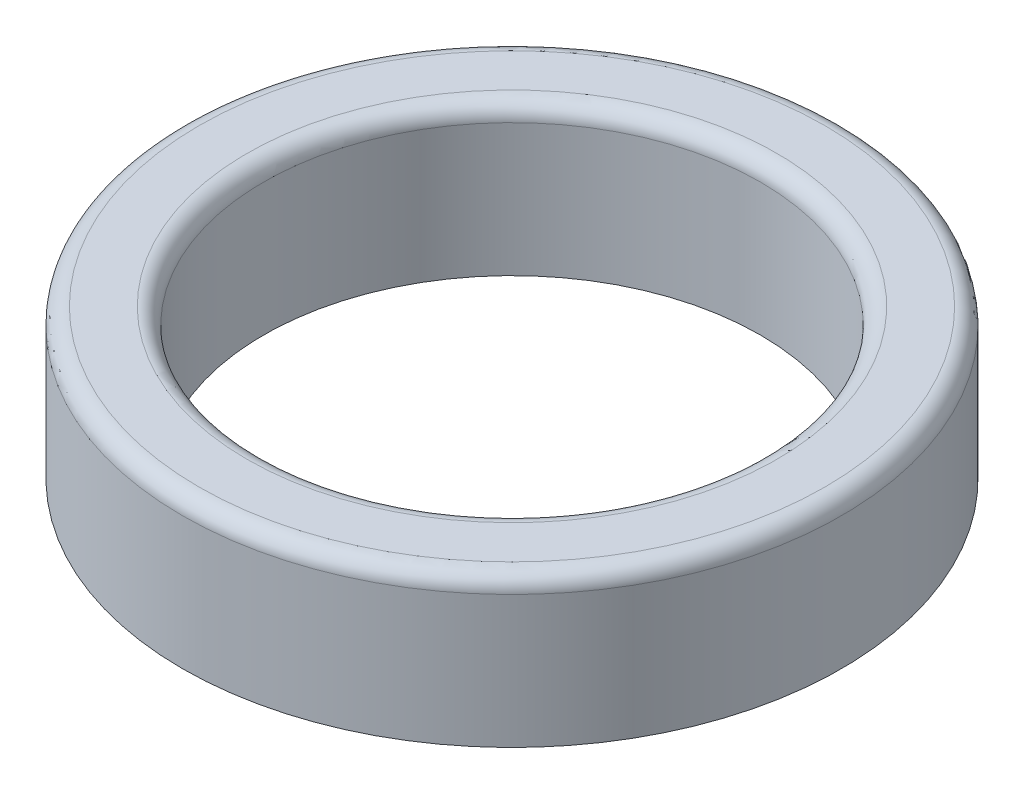
ISO-10303-21;
HEADER;
FILE_DESCRIPTION(('STEP AP214'),'2;1');
FILE_NAME('part.step','',(''),(''),'','','');
FILE_SCHEMA(('AUTOMOTIVE_DESIGN { 1 0 10303 214 1 1 1 1 }'));
ENDSEC;
DATA;
#1=APPLICATION_CONTEXT('core data for automotive mechanical design processes');
#2=APPLICATION_PROTOCOL_DEFINITION('international standard','automotive_design',2000,#1);
#3=PRODUCT_CONTEXT('',#1,'mechanical');
#4=PRODUCT('Part','Part','',(#3));
#5=PRODUCT_RELATED_PRODUCT_CATEGORY('part','',(#4));
#6=PRODUCT_DEFINITION_FORMATION('','',#4);
#7=PRODUCT_DEFINITION_CONTEXT('part definition',#1,'design');
#8=PRODUCT_DEFINITION('design','',#6,#7);
#9=PRODUCT_DEFINITION_SHAPE('','',#8);
#10=(LENGTH_UNIT() NAMED_UNIT(*) SI_UNIT(.MILLI.,.METRE.));
#11=(NAMED_UNIT(*) PLANE_ANGLE_UNIT() SI_UNIT($,.RADIAN.));
#12=(NAMED_UNIT(*) SI_UNIT($,.STERADIAN.) SOLID_ANGLE_UNIT());
#13=UNCERTAINTY_MEASURE_WITH_UNIT(LENGTH_MEASURE(1.E-05),#10,'distance_accuracy_value','');
#14=(GEOMETRIC_REPRESENTATION_CONTEXT(3) GLOBAL_UNCERTAINTY_ASSIGNED_CONTEXT((#13)) GLOBAL_UNIT_ASSIGNED_CONTEXT((#10,
#11,#12)) REPRESENTATION_CONTEXT('',''));
#15=CARTESIAN_POINT('',(0.,0.,0.));
#16=DIRECTION('',(0.,0.,1.));
#17=DIRECTION('',(1.,0.,0.));
#18=AXIS2_PLACEMENT_3D('',#15,#16,#17);
#19=CARTESIAN_POINT('',(0.,9.,0.));
#20=DIRECTION('',(0.,1.,0.));
#21=DIRECTION('',(0.,0.,1.));
#22=AXIS2_PLACEMENT_3D('',#19,#20,#21);
#23=PLANE('',#22);
#24=CARTESIAN_POINT('',(0.,9.,0.));
#25=DIRECTION('',(0.,1.,0.));
#26=DIRECTION('',(0.,0.,1.));
#27=AXIS2_PLACEMENT_3D('',#24,#25,#26);
#28=CIRCLE('',#27,16.);
#29=CARTESIAN_POINT('',(0.,9.,16.));
#30=VERTEX_POINT('',#29);
#31=EDGE_CURVE('E38',#30,#30,#28,.F.);
#32=ORIENTED_EDGE('',*,*,#31,.T.);
#33=EDGE_LOOP('',(#32));
#34=FACE_BOUND('',#33,.T.);
#35=CARTESIAN_POINT('',(0.,9.,0.));
#36=DIRECTION('',(0.,1.,0.));
#37=DIRECTION('',(0.,0.,1.));
#38=AXIS2_PLACEMENT_3D('',#35,#36,#37);
#39=CIRCLE('',#38,18.9);
#40=CARTESIAN_POINT('',(0.,9.,18.9));
#41=VERTEX_POINT('',#40);
#42=EDGE_CURVE('E42',#41,#41,#39,.T.);
#43=ORIENTED_EDGE('',*,*,#42,.T.);
#44=EDGE_LOOP('',(#43));
#45=FACE_BOUND('',#44,.T.);
#46=ADVANCED_FACE('F31',(#34,#45),#23,.T.);
#47=CARTESIAN_POINT('',(0.,0.,0.));
#48=DIRECTION('',(0.,1.,0.));
#49=DIRECTION('',(0.,0.,1.));
#50=AXIS2_PLACEMENT_3D('',#47,#48,#49);
#51=PLANE('',#50);
#52=CARTESIAN_POINT('',(0.,0.,0.));
#53=DIRECTION('',(0.,1.,0.));
#54=DIRECTION('',(0.,0.,1.));
#55=AXIS2_PLACEMENT_3D('',#52,#53,#54);
#56=CIRCLE('',#55,19.9);
#57=CARTESIAN_POINT('',(0.,0.,19.9));
#58=VERTEX_POINT('',#57);
#59=EDGE_CURVE('E51',#58,#58,#56,.T.);
#60=ORIENTED_EDGE('',*,*,#59,.F.);
#61=EDGE_LOOP('',(#60));
#62=FACE_BOUND('',#61,.T.);
#63=CARTESIAN_POINT('',(0.,0.,0.));
#64=DIRECTION('',(0.,1.,0.));
#65=DIRECTION('',(0.,0.,1.));
#66=AXIS2_PLACEMENT_3D('',#63,#64,#65);
#67=CIRCLE('',#66,15.);
#68=CARTESIAN_POINT('',(0.,0.,15.));
#69=VERTEX_POINT('',#68);
#70=EDGE_CURVE('E54',#69,#69,#67,.T.);
#71=ORIENTED_EDGE('',*,*,#70,.T.);
#72=EDGE_LOOP('',(#71));
#73=FACE_BOUND('',#72,.T.);
#74=ADVANCED_FACE('F58',(#62,#73),#51,.F.);
#75=CARTESIAN_POINT('',(0.,9.,0.));
#76=DIRECTION('',(0.,-1.,0.));
#77=DIRECTION('',(0.,0.,-1.));
#78=AXIS2_PLACEMENT_3D('',#75,#76,#77);
#79=CYLINDRICAL_SURFACE('',#78,19.9);
#80=CARTESIAN_POINT('',(0.,8.,0.));
#81=DIRECTION('',(0.,1.,0.));
#82=DIRECTION('',(0.,0.,1.));
#83=AXIS2_PLACEMENT_3D('',#80,#81,#82);
#84=CIRCLE('',#83,19.9);
#85=CARTESIAN_POINT('',(0.,8.,19.9));
#86=VERTEX_POINT('',#85);
#87=EDGE_CURVE('E10',#86,#86,#84,.F.);
#88=ORIENTED_EDGE('',*,*,#87,.T.);
#89=EDGE_LOOP('',(#88));
#90=FACE_BOUND('',#89,.T.);
#91=ORIENTED_EDGE('',*,*,#59,.T.);
#92=EDGE_LOOP('',(#91));
#93=FACE_BOUND('',#92,.T.);
#94=ADVANCED_FACE('F63',(#90,#93),#79,.T.);
#95=CARTESIAN_POINT('',(0.,9.,0.));
#96=DIRECTION('',(0.,-1.,0.));
#97=DIRECTION('',(0.,0.,-1.));
#98=AXIS2_PLACEMENT_3D('',#95,#96,#97);
#99=CYLINDRICAL_SURFACE('',#98,15.);
#100=CARTESIAN_POINT('',(0.,8.,0.));
#101=DIRECTION('',(0.,1.,0.));
#102=DIRECTION('',(0.,0.,1.));
#103=AXIS2_PLACEMENT_3D('',#100,#101,#102);
#104=CIRCLE('',#103,15.);
#105=CARTESIAN_POINT('',(0.,8.,15.));
#106=VERTEX_POINT('',#105);
#107=EDGE_CURVE('E46',#106,#106,#104,.T.);
#108=ORIENTED_EDGE('',*,*,#107,.T.);
#109=EDGE_LOOP('',(#108));
#110=FACE_BOUND('',#109,.T.);
#111=ORIENTED_EDGE('',*,*,#70,.F.);
#112=EDGE_LOOP('',(#111));
#113=FACE_BOUND('',#112,.T.);
#114=ADVANCED_FACE('F60',(#110,#113),#99,.F.);
#115=CARTESIAN_POINT('',(0.,8.,0.));
#116=DIRECTION('',(0.,1.,0.));
#117=DIRECTION('',(0.,0.,1.));
#118=AXIS2_PLACEMENT_3D('',#115,#116,#117);
#119=TOROIDAL_SURFACE('',#118,16.,1.);
#120=ORIENTED_EDGE('',*,*,#31,.F.);
#121=EDGE_LOOP('',(#120));
#122=FACE_BOUND('',#121,.T.);
#123=ORIENTED_EDGE('',*,*,#107,.F.);
#124=EDGE_LOOP('',(#123));
#125=FACE_BOUND('',#124,.T.);
#126=ADVANCED_FACE('F62',(#122,#125),#119,.T.);
#127=CARTESIAN_POINT('',(0.,8.,0.));
#128=DIRECTION('',(0.,1.,0.));
#129=DIRECTION('',(0.,0.,1.));
#130=AXIS2_PLACEMENT_3D('',#127,#128,#129);
#131=TOROIDAL_SURFACE('',#130,18.9,1.);
#132=ORIENTED_EDGE('',*,*,#87,.F.);
#133=EDGE_LOOP('',(#132));
#134=FACE_BOUND('',#133,.T.);
#135=ORIENTED_EDGE('',*,*,#42,.F.);
#136=EDGE_LOOP('',(#135));
#137=FACE_BOUND('',#136,.T.);
#138=ADVANCED_FACE('F33',(#134,#137),#131,.T.);
#139=CLOSED_SHELL('',(#46,#74,#94,#114,#126,#138));
#140=MANIFOLD_SOLID_BREP('B2',#139);
#141=ADVANCED_BREP_SHAPE_REPRESENTATION('',(#18,#140),#14);
#142=SHAPE_DEFINITION_REPRESENTATION(#9,#141);
ENDSEC;
END-ISO-10303-21;
